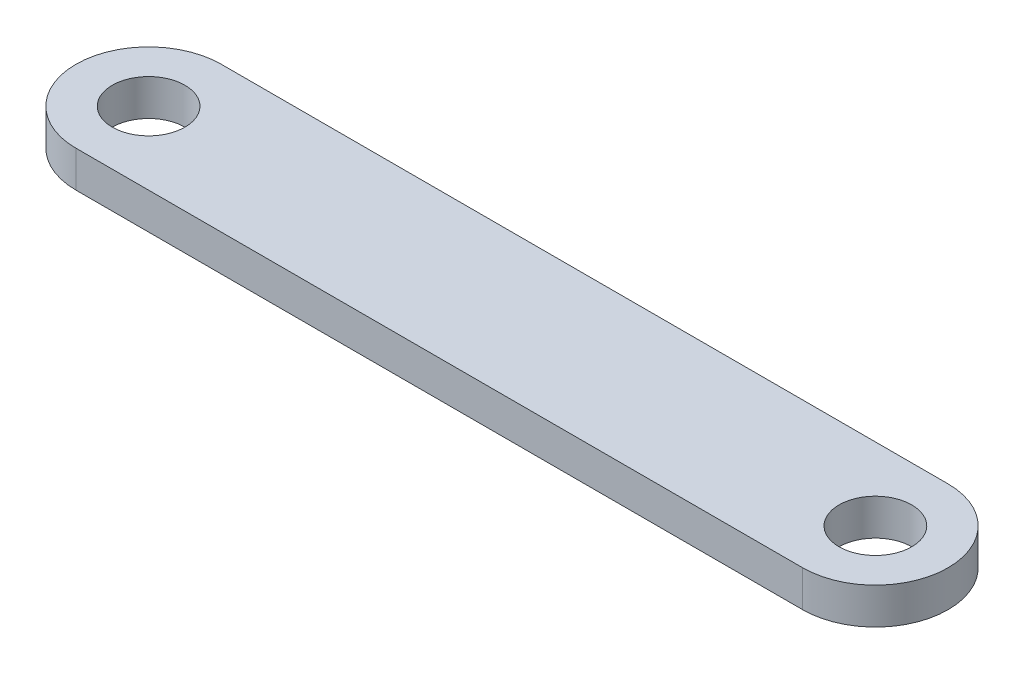
ISO-10303-21;
HEADER;
FILE_DESCRIPTION(('STEP AP214'),'2;1');
FILE_NAME('part.step','',(''),(''),'','','');
FILE_SCHEMA(('AUTOMOTIVE_DESIGN { 1 0 10303 214 1 1 1 1 }'));
ENDSEC;
DATA;
#1=APPLICATION_CONTEXT('core data for automotive mechanical design processes');
#2=APPLICATION_PROTOCOL_DEFINITION('international standard','automotive_design',2000,#1);
#3=PRODUCT_CONTEXT('',#1,'mechanical');
#4=PRODUCT('Part','Part','',(#3));
#5=PRODUCT_RELATED_PRODUCT_CATEGORY('part','',(#4));
#6=PRODUCT_DEFINITION_FORMATION('','',#4);
#7=PRODUCT_DEFINITION_CONTEXT('part definition',#1,'design');
#8=PRODUCT_DEFINITION('design','',#6,#7);
#9=PRODUCT_DEFINITION_SHAPE('','',#8);
#10=(LENGTH_UNIT() NAMED_UNIT(*) SI_UNIT(.MILLI.,.METRE.));
#11=(NAMED_UNIT(*) PLANE_ANGLE_UNIT() SI_UNIT($,.RADIAN.));
#12=(NAMED_UNIT(*) SI_UNIT($,.STERADIAN.) SOLID_ANGLE_UNIT());
#13=UNCERTAINTY_MEASURE_WITH_UNIT(LENGTH_MEASURE(1.E-05),#10,'distance_accuracy_value','');
#14=(GEOMETRIC_REPRESENTATION_CONTEXT(3) GLOBAL_UNCERTAINTY_ASSIGNED_CONTEXT((#13)) GLOBAL_UNIT_ASSIGNED_CONTEXT((#10,
#11,#12)) REPRESENTATION_CONTEXT('',''));
#15=CARTESIAN_POINT('',(0.,0.,0.));
#16=DIRECTION('',(0.,0.,1.));
#17=DIRECTION('',(1.,0.,0.));
#18=AXIS2_PLACEMENT_3D('',#15,#16,#17);
#19=CARTESIAN_POINT('',(-50.,5.,0.));
#20=DIRECTION('',(0.,1.,0.));
#21=DIRECTION('',(0.,0.,1.));
#22=AXIS2_PLACEMENT_3D('',#19,#20,#21);
#23=PLANE('',#22);
#24=CARTESIAN_POINT('',(-50.,5.,0.));
#25=DIRECTION('',(0.,1.,0.));
#26=DIRECTION('',(0.,0.,1.));
#27=AXIS2_PLACEMENT_3D('',#24,#25,#26);
#28=CIRCLE('',#27,5.00000000000002);
#29=CARTESIAN_POINT('',(-50.,5.,5.00000000000002));
#30=VERTEX_POINT('',#29);
#31=EDGE_CURVE('E106',#30,#30,#28,.T.);
#32=ORIENTED_EDGE('',*,*,#31,.F.);
#33=EDGE_LOOP('',(#32));
#34=FACE_BOUND('',#33,.T.);
#35=CARTESIAN_POINT('',(-50.,5.,0.));
#36=DIRECTION('',(0.,1.,0.));
#37=DIRECTION('',(0.,0.,1.));
#38=AXIS2_PLACEMENT_3D('',#35,#36,#37);
#39=CIRCLE('',#38,10.);
#40=CARTESIAN_POINT('',(-50.,5.,-10.));
#41=VERTEX_POINT('',#40);
#42=CARTESIAN_POINT('',(-50.,5.,10.));
#43=VERTEX_POINT('',#42);
#44=EDGE_CURVE('E91',#41,#43,#39,.T.);
#45=ORIENTED_EDGE('',*,*,#44,.T.);
#46=DIRECTION('',(1.,0.,0.));
#47=VECTOR('',#46,1.);
#48=CARTESIAN_POINT('',(-50.,5.,10.));
#49=LINE('',#48,#47);
#50=CARTESIAN_POINT('',(50.,5.,10.));
#51=VERTEX_POINT('',#50);
#52=EDGE_CURVE('E86',#43,#51,#49,.T.);
#53=ORIENTED_EDGE('',*,*,#52,.T.);
#54=CARTESIAN_POINT('',(50.,5.,0.));
#55=DIRECTION('',(0.,1.,0.));
#56=DIRECTION('',(0.,0.,1.));
#57=AXIS2_PLACEMENT_3D('',#54,#55,#56);
#58=CIRCLE('',#57,10.);
#59=CARTESIAN_POINT('',(50.,5.,-10.));
#60=VERTEX_POINT('',#59);
#61=EDGE_CURVE('E89',#51,#60,#58,.T.);
#62=ORIENTED_EDGE('',*,*,#61,.T.);
#63=DIRECTION('',(-1.,0.,0.));
#64=VECTOR('',#63,1.);
#65=CARTESIAN_POINT('',(-50.,5.,-10.));
#66=LINE('',#65,#64);
#67=EDGE_CURVE('E56',#60,#41,#66,.T.);
#68=ORIENTED_EDGE('',*,*,#67,.T.);
#69=EDGE_LOOP('',(#45,#53,#62,#68));
#70=FACE_BOUND('',#69,.T.);
#71=CARTESIAN_POINT('',(50.,5.,0.));
#72=DIRECTION('',(0.,1.,0.));
#73=DIRECTION('',(0.,0.,1.));
#74=AXIS2_PLACEMENT_3D('',#71,#72,#73);
#75=CIRCLE('',#74,5.00000000000002);
#76=CARTESIAN_POINT('',(50.,5.,5.00000000000002));
#77=VERTEX_POINT('',#76);
#78=EDGE_CURVE('E121',#77,#77,#75,.T.);
#79=ORIENTED_EDGE('',*,*,#78,.F.);
#80=EDGE_LOOP('',(#79));
#81=FACE_BOUND('',#80,.T.);
#82=ADVANCED_FACE('F39',(#34,#70,#81),#23,.T.);
#83=CARTESIAN_POINT('',(-50.,0.,0.));
#84=DIRECTION('',(0.,1.,0.));
#85=DIRECTION('',(0.,0.,1.));
#86=AXIS2_PLACEMENT_3D('',#83,#84,#85);
#87=PLANE('',#86);
#88=CARTESIAN_POINT('',(-50.,0.,0.));
#89=DIRECTION('',(0.,1.,0.));
#90=DIRECTION('',(0.,0.,1.));
#91=AXIS2_PLACEMENT_3D('',#88,#89,#90);
#92=CIRCLE('',#91,10.);
#93=CARTESIAN_POINT('',(-50.,0.,-10.));
#94=VERTEX_POINT('',#93);
#95=CARTESIAN_POINT('',(-50.,0.,10.));
#96=VERTEX_POINT('',#95);
#97=EDGE_CURVE('E103',#94,#96,#92,.T.);
#98=ORIENTED_EDGE('',*,*,#97,.F.);
#99=DIRECTION('',(-1.,0.,0.));
#100=VECTOR('',#99,1.);
#101=CARTESIAN_POINT('',(-50.,0.,-10.));
#102=LINE('',#101,#100);
#103=CARTESIAN_POINT('',(50.,0.,-10.));
#104=VERTEX_POINT('',#103);
#105=EDGE_CURVE('E79',#104,#94,#102,.T.);
#106=ORIENTED_EDGE('',*,*,#105,.F.);
#107=CARTESIAN_POINT('',(50.,0.,0.));
#108=DIRECTION('',(0.,1.,0.));
#109=DIRECTION('',(0.,0.,1.));
#110=AXIS2_PLACEMENT_3D('',#107,#108,#109);
#111=CIRCLE('',#110,10.);
#112=CARTESIAN_POINT('',(50.,0.,10.));
#113=VERTEX_POINT('',#112);
#114=EDGE_CURVE('E73',#113,#104,#111,.T.);
#115=ORIENTED_EDGE('',*,*,#114,.F.);
#116=DIRECTION('',(1.,0.,0.));
#117=VECTOR('',#116,1.);
#118=CARTESIAN_POINT('',(-50.,0.,10.));
#119=LINE('',#118,#117);
#120=EDGE_CURVE('E95',#96,#113,#119,.T.);
#121=ORIENTED_EDGE('',*,*,#120,.F.);
#122=EDGE_LOOP('',(#98,#106,#115,#121));
#123=FACE_BOUND('',#122,.T.);
#124=CARTESIAN_POINT('',(-50.,0.,0.));
#125=DIRECTION('',(0.,1.,0.));
#126=DIRECTION('',(0.,0.,1.));
#127=AXIS2_PLACEMENT_3D('',#124,#125,#126);
#128=CIRCLE('',#127,5.00000000000002);
#129=CARTESIAN_POINT('',(-50.,0.,5.00000000000002));
#130=VERTEX_POINT('',#129);
#131=EDGE_CURVE('E118',#130,#130,#128,.T.);
#132=ORIENTED_EDGE('',*,*,#131,.T.);
#133=EDGE_LOOP('',(#132));
#134=FACE_BOUND('',#133,.T.);
#135=CARTESIAN_POINT('',(50.,0.,0.));
#136=DIRECTION('',(0.,1.,0.));
#137=DIRECTION('',(0.,0.,1.));
#138=AXIS2_PLACEMENT_3D('',#135,#136,#137);
#139=CIRCLE('',#138,5.00000000000002);
#140=CARTESIAN_POINT('',(50.,0.,5.00000000000002));
#141=VERTEX_POINT('',#140);
#142=EDGE_CURVE('E124',#141,#141,#139,.T.);
#143=ORIENTED_EDGE('',*,*,#142,.T.);
#144=EDGE_LOOP('',(#143));
#145=FACE_BOUND('',#144,.T.);
#146=ADVANCED_FACE('F114',(#123,#134,#145),#87,.F.);
#147=CARTESIAN_POINT('',(-50.,5.,0.));
#148=DIRECTION('',(0.,-1.,0.));
#149=DIRECTION('',(0.,0.,-1.));
#150=AXIS2_PLACEMENT_3D('',#147,#148,#149);
#151=CYLINDRICAL_SURFACE('',#150,10.);
#152=ORIENTED_EDGE('',*,*,#97,.T.);
#153=DIRECTION('',(0.,-1.,0.));
#154=VECTOR('',#153,1.);
#155=CARTESIAN_POINT('',(-50.,5.,10.));
#156=LINE('',#155,#154);
#157=EDGE_CURVE('E11',#43,#96,#156,.T.);
#158=ORIENTED_EDGE('',*,*,#157,.F.);
#159=ORIENTED_EDGE('',*,*,#44,.F.);
#160=DIRECTION('',(0.,-1.,0.));
#161=VECTOR('',#160,1.);
#162=CARTESIAN_POINT('',(-50.,5.,-10.));
#163=LINE('',#162,#161);
#164=EDGE_CURVE('E99',#41,#94,#163,.T.);
#165=ORIENTED_EDGE('',*,*,#164,.T.);
#166=EDGE_LOOP('',(#152,#158,#159,#165));
#167=FACE_BOUND('',#166,.T.);
#168=ADVANCED_FACE('F41',(#167),#151,.T.);
#169=CARTESIAN_POINT('',(-50.,5.,10.));
#170=DIRECTION('',(0.,0.,-1.));
#171=DIRECTION('',(-1.,0.,0.));
#172=AXIS2_PLACEMENT_3D('',#169,#170,#171);
#173=PLANE('',#172);
#174=ORIENTED_EDGE('',*,*,#120,.T.);
#175=DIRECTION('',(0.,-1.,0.));
#176=VECTOR('',#175,1.);
#177=CARTESIAN_POINT('',(50.,5.,10.));
#178=LINE('',#177,#176);
#179=EDGE_CURVE('E48',#51,#113,#178,.T.);
#180=ORIENTED_EDGE('',*,*,#179,.F.);
#181=ORIENTED_EDGE('',*,*,#52,.F.);
#182=ORIENTED_EDGE('',*,*,#157,.T.);
#183=EDGE_LOOP('',(#174,#180,#181,#182));
#184=FACE_BOUND('',#183,.T.);
#185=ADVANCED_FACE('F94',(#184),#173,.F.);
#186=CARTESIAN_POINT('',(50.,5.,0.));
#187=DIRECTION('',(0.,-1.,0.));
#188=DIRECTION('',(0.,0.,-1.));
#189=AXIS2_PLACEMENT_3D('',#186,#187,#188);
#190=CYLINDRICAL_SURFACE('',#189,10.);
#191=ORIENTED_EDGE('',*,*,#114,.T.);
#192=DIRECTION('',(0.,-1.,0.));
#193=VECTOR('',#192,1.);
#194=CARTESIAN_POINT('',(50.,5.,-10.));
#195=LINE('',#194,#193);
#196=EDGE_CURVE('E96',#60,#104,#195,.T.);
#197=ORIENTED_EDGE('',*,*,#196,.F.);
#198=ORIENTED_EDGE('',*,*,#61,.F.);
#199=ORIENTED_EDGE('',*,*,#179,.T.);
#200=EDGE_LOOP('',(#191,#197,#198,#199));
#201=FACE_BOUND('',#200,.T.);
#202=ADVANCED_FACE('F97',(#201),#190,.T.);
#203=CARTESIAN_POINT('',(-50.,5.,-10.));
#204=DIRECTION('',(0.,0.,1.));
#205=DIRECTION('',(1.,0.,0.));
#206=AXIS2_PLACEMENT_3D('',#203,#204,#205);
#207=PLANE('',#206);
#208=ORIENTED_EDGE('',*,*,#105,.T.);
#209=ORIENTED_EDGE('',*,*,#164,.F.);
#210=ORIENTED_EDGE('',*,*,#67,.F.);
#211=ORIENTED_EDGE('',*,*,#196,.T.);
#212=EDGE_LOOP('',(#208,#209,#210,#211));
#213=FACE_BOUND('',#212,.T.);
#214=ADVANCED_FACE('F111',(#213),#207,.F.);
#215=CARTESIAN_POINT('',(-50.,5.,0.));
#216=DIRECTION('',(0.,-1.,0.));
#217=DIRECTION('',(0.,0.,-1.));
#218=AXIS2_PLACEMENT_3D('',#215,#216,#217);
#219=CYLINDRICAL_SURFACE('',#218,5.00000000000002);
#220=ORIENTED_EDGE('',*,*,#31,.T.);
#221=EDGE_LOOP('',(#220));
#222=FACE_BOUND('',#221,.T.);
#223=ORIENTED_EDGE('',*,*,#131,.F.);
#224=EDGE_LOOP('',(#223));
#225=FACE_BOUND('',#224,.T.);
#226=ADVANCED_FACE('F141',(#222,#225),#219,.F.);
#227=CARTESIAN_POINT('',(50.,5.,0.));
#228=DIRECTION('',(0.,-1.,0.));
#229=DIRECTION('',(0.,0.,-1.));
#230=AXIS2_PLACEMENT_3D('',#227,#228,#229);
#231=CYLINDRICAL_SURFACE('',#230,5.00000000000002);
#232=ORIENTED_EDGE('',*,*,#78,.T.);
#233=EDGE_LOOP('',(#232));
#234=FACE_BOUND('',#233,.T.);
#235=ORIENTED_EDGE('',*,*,#142,.F.);
#236=EDGE_LOOP('',(#235));
#237=FACE_BOUND('',#236,.T.);
#238=ADVANCED_FACE('F130',(#234,#237),#231,.F.);
#239=CLOSED_SHELL('',(#82,#146,#168,#185,#202,#214,#226,#238));
#240=MANIFOLD_SOLID_BREP('B2',#239);
#241=ADVANCED_BREP_SHAPE_REPRESENTATION('',(#18,#240),#14);
#242=SHAPE_DEFINITION_REPRESENTATION(#9,#241);
ENDSEC;
END-ISO-10303-21;
